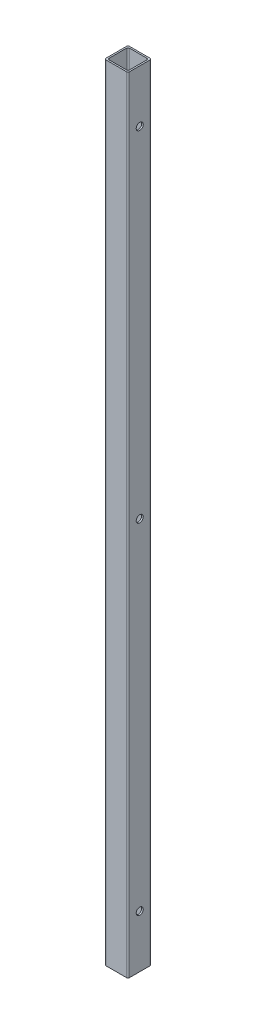
ISO-10303-21;
HEADER;
FILE_DESCRIPTION(('STEP AP214'),'2;1');
FILE_NAME('part.step','',(''),(''),'','','');
FILE_SCHEMA(('AUTOMOTIVE_DESIGN { 1 0 10303 214 1 1 1 1 }'));
ENDSEC;
DATA;
#1=APPLICATION_CONTEXT('core data for automotive mechanical design processes');
#2=APPLICATION_PROTOCOL_DEFINITION('international standard','automotive_design',2000,#1);
#3=PRODUCT_CONTEXT('',#1,'mechanical');
#4=PRODUCT('Part','Part','',(#3));
#5=PRODUCT_RELATED_PRODUCT_CATEGORY('part','',(#4));
#6=PRODUCT_DEFINITION_FORMATION('','',#4);
#7=PRODUCT_DEFINITION_CONTEXT('part definition',#1,'design');
#8=PRODUCT_DEFINITION('design','',#6,#7);
#9=PRODUCT_DEFINITION_SHAPE('','',#8);
#10=(LENGTH_UNIT() NAMED_UNIT(*) SI_UNIT(.MILLI.,.METRE.));
#11=(NAMED_UNIT(*) PLANE_ANGLE_UNIT() SI_UNIT($,.RADIAN.));
#12=(NAMED_UNIT(*) SI_UNIT($,.STERADIAN.) SOLID_ANGLE_UNIT());
#13=UNCERTAINTY_MEASURE_WITH_UNIT(LENGTH_MEASURE(1.E-05),#10,'distance_accuracy_value','');
#14=(GEOMETRIC_REPRESENTATION_CONTEXT(3) GLOBAL_UNCERTAINTY_ASSIGNED_CONTEXT((#13)) GLOBAL_UNIT_ASSIGNED_CONTEXT((#10,
#11,#12)) REPRESENTATION_CONTEXT('',''));
#15=CARTESIAN_POINT('',(0.,0.,0.));
#16=DIRECTION('',(0.,0.,1.));
#17=DIRECTION('',(1.,0.,0.));
#18=AXIS2_PLACEMENT_3D('',#15,#16,#17);
#19=CARTESIAN_POINT('',(9.652,645.16,9.652));
#20=DIRECTION('',(-1.,0.,0.));
#21=DIRECTION('',(0.,0.,1.));
#22=AXIS2_PLACEMENT_3D('',#19,#20,#21);
#23=PLANE('',#22);
#24=CARTESIAN_POINT('',(9.652,601.98,0.));
#25=DIRECTION('',(1.,0.,0.));
#26=DIRECTION('',(0.,0.,-1.));
#27=AXIS2_PLACEMENT_3D('',#24,#25,#26);
#28=CIRCLE('',#27,2.8956);
#29=CARTESIAN_POINT('',(9.652,601.98,-2.8956));
#30=VERTEX_POINT('',#29);
#31=EDGE_CURVE('E604',#30,#30,#28,.T.);
#32=ORIENTED_EDGE('',*,*,#31,.F.);
#33=EDGE_LOOP('',(#32));
#34=FACE_BOUND('',#33,.T.);
#35=CARTESIAN_POINT('',(9.652,322.58,0.));
#36=DIRECTION('',(1.,0.,0.));
#37=DIRECTION('',(0.,0.,-1.));
#38=AXIS2_PLACEMENT_3D('',#35,#36,#37);
#39=CIRCLE('',#38,2.8956);
#40=CARTESIAN_POINT('',(9.652,322.58,-2.8956));
#41=VERTEX_POINT('',#40);
#42=EDGE_CURVE('E257',#41,#41,#39,.T.);
#43=ORIENTED_EDGE('',*,*,#42,.F.);
#44=EDGE_LOOP('',(#43));
#45=FACE_BOUND('',#44,.T.);
#46=DIRECTION('',(0.,0.,-1.));
#47=VECTOR('',#46,1.);
#48=CARTESIAN_POINT('',(9.652,0.,9.652));
#49=LINE('',#48,#47);
#50=CARTESIAN_POINT('',(9.652,0.,8.382));
#51=VERTEX_POINT('',#50);
#52=CARTESIAN_POINT('',(9.652,0.,-8.382));
#53=VERTEX_POINT('',#52);
#54=EDGE_CURVE('E284',#51,#53,#49,.T.);
#55=ORIENTED_EDGE('',*,*,#54,.T.);
#56=DIRECTION('',(0.,-1.,0.));
#57=VECTOR('',#56,1.);
#58=CARTESIAN_POINT('',(9.652,645.16,-8.382));
#59=LINE('',#58,#57);
#60=CARTESIAN_POINT('',(9.652,645.16,-8.382));
#61=VERTEX_POINT('',#60);
#62=EDGE_CURVE('E232',#53,#61,#59,.F.);
#63=ORIENTED_EDGE('',*,*,#62,.T.);
#64=DIRECTION('',(0.,0.,-1.));
#65=VECTOR('',#64,1.);
#66=CARTESIAN_POINT('',(9.652,645.16,9.652));
#67=LINE('',#66,#65);
#68=CARTESIAN_POINT('',(9.652,645.16,8.382));
#69=VERTEX_POINT('',#68);
#70=EDGE_CURVE('E290',#69,#61,#67,.T.);
#71=ORIENTED_EDGE('',*,*,#70,.F.);
#72=DIRECTION('',(0.,-1.,0.));
#73=VECTOR('',#72,1.);
#74=CARTESIAN_POINT('',(9.652,645.16,8.382));
#75=LINE('',#74,#73);
#76=EDGE_CURVE('E229',#69,#51,#75,.T.);
#77=ORIENTED_EDGE('',*,*,#76,.T.);
#78=EDGE_LOOP('',(#55,#63,#71,#77));
#79=FACE_BOUND('',#78,.T.);
#80=CARTESIAN_POINT('',(9.652,43.18,0.));
#81=DIRECTION('',(1.,0.,0.));
#82=DIRECTION('',(0.,0.,-1.));
#83=AXIS2_PLACEMENT_3D('',#80,#81,#82);
#84=CIRCLE('',#83,2.89559999999998);
#85=CARTESIAN_POINT('',(9.652,43.18,-2.89559999999999));
#86=VERTEX_POINT('',#85);
#87=EDGE_CURVE('E254',#86,#86,#84,.T.);
#88=ORIENTED_EDGE('',*,*,#87,.F.);
#89=EDGE_LOOP('',(#88));
#90=FACE_BOUND('',#89,.T.);
#91=ADVANCED_FACE('F35',(#34,#45,#79,#90),#23,.F.);
#92=CARTESIAN_POINT('',(0.,645.16,0.));
#93=DIRECTION('',(0.,-1.,0.));
#94=DIRECTION('',(0.,0.,-1.));
#95=AXIS2_PLACEMENT_3D('',#92,#93,#94);
#96=PLANE('',#95);
#97=DIRECTION('',(0.,0.,1.));
#98=VECTOR('',#97,1.);
#99=CARTESIAN_POINT('',(-9.652,645.16,9.652));
#100=LINE('',#99,#98);
#101=CARTESIAN_POINT('',(-9.652,645.16,-8.382));
#102=VERTEX_POINT('',#101);
#103=CARTESIAN_POINT('',(-9.652,645.16,8.382));
#104=VERTEX_POINT('',#103);
#105=EDGE_CURVE('E181',#102,#104,#100,.T.);
#106=ORIENTED_EDGE('',*,*,#105,.T.);
#107=CARTESIAN_POINT('',(-8.382,645.16,8.382));
#108=DIRECTION('',(0.,-1.,0.));
#109=DIRECTION('',(0.,0.,-1.));
#110=AXIS2_PLACEMENT_3D('',#107,#108,#109);
#111=CIRCLE('',#110,1.27);
#112=CARTESIAN_POINT('',(-8.382,645.16,9.652));
#113=VERTEX_POINT('',#112);
#114=EDGE_CURVE('E223',#104,#113,#111,.F.);
#115=ORIENTED_EDGE('',*,*,#114,.T.);
#116=DIRECTION('',(1.,0.,0.));
#117=VECTOR('',#116,1.);
#118=CARTESIAN_POINT('',(-9.652,645.16,9.652));
#119=LINE('',#118,#117);
#120=CARTESIAN_POINT('',(8.382,645.16,9.652));
#121=VERTEX_POINT('',#120);
#122=EDGE_CURVE('E176',#113,#121,#119,.T.);
#123=ORIENTED_EDGE('',*,*,#122,.T.);
#124=CARTESIAN_POINT('',(8.382,645.16,8.382));
#125=DIRECTION('',(0.,-1.,0.));
#126=DIRECTION('',(0.,0.,-1.));
#127=AXIS2_PLACEMENT_3D('',#124,#125,#126);
#128=CIRCLE('',#127,1.27);
#129=EDGE_CURVE('E218',#121,#69,#128,.F.);
#130=ORIENTED_EDGE('',*,*,#129,.T.);
#131=ORIENTED_EDGE('',*,*,#70,.T.);
#132=CARTESIAN_POINT('',(8.382,645.16,-8.382));
#133=DIRECTION('',(0.,-1.,0.));
#134=DIRECTION('',(0.,0.,-1.));
#135=AXIS2_PLACEMENT_3D('',#132,#133,#134);
#136=CIRCLE('',#135,1.27);
#137=CARTESIAN_POINT('',(8.382,645.16,-9.652));
#138=VERTEX_POINT('',#137);
#139=EDGE_CURVE('E59',#61,#138,#136,.F.);
#140=ORIENTED_EDGE('',*,*,#139,.T.);
#141=DIRECTION('',(-1.,0.,0.));
#142=VECTOR('',#141,1.);
#143=CARTESIAN_POINT('',(-9.652,645.16,-9.652));
#144=LINE('',#143,#142);
#145=CARTESIAN_POINT('',(-8.382,645.16,-9.652));
#146=VERTEX_POINT('',#145);
#147=EDGE_CURVE('E292',#138,#146,#144,.T.);
#148=ORIENTED_EDGE('',*,*,#147,.T.);
#149=CARTESIAN_POINT('',(-8.382,645.16,-8.382));
#150=DIRECTION('',(0.,-1.,0.));
#151=DIRECTION('',(0.,0.,-1.));
#152=AXIS2_PLACEMENT_3D('',#149,#150,#151);
#153=CIRCLE('',#152,1.27);
#154=EDGE_CURVE('E221',#146,#102,#153,.F.);
#155=ORIENTED_EDGE('',*,*,#154,.T.);
#156=EDGE_LOOP('',(#106,#115,#123,#130,#131,#140,#148,#155));
#157=FACE_BOUND('',#156,.T.);
#158=DIRECTION('',(1.,0.,0.));
#159=VECTOR('',#158,1.);
#160=CARTESIAN_POINT('',(-8.382,645.16,8.382));
#161=LINE('',#160,#159);
#162=CARTESIAN_POINT('',(-7.112,645.16,8.382));
#163=VERTEX_POINT('',#162);
#164=CARTESIAN_POINT('',(7.112,645.16,8.382));
#165=VERTEX_POINT('',#164);
#166=EDGE_CURVE('E273',#163,#165,#161,.T.);
#167=ORIENTED_EDGE('',*,*,#166,.F.);
#168=CARTESIAN_POINT('',(-7.112,645.16,7.112));
#169=DIRECTION('',(0.,-1.,0.));
#170=DIRECTION('',(0.,0.,-1.));
#171=AXIS2_PLACEMENT_3D('',#168,#169,#170);
#172=CIRCLE('',#171,1.27);
#173=CARTESIAN_POINT('',(-8.382,645.16,7.112));
#174=VERTEX_POINT('',#173);
#175=EDGE_CURVE('E11',#163,#174,#172,.T.);
#176=ORIENTED_EDGE('',*,*,#175,.T.);
#177=DIRECTION('',(0.,0.,1.));
#178=VECTOR('',#177,1.);
#179=CARTESIAN_POINT('',(-8.382,645.16,8.382));
#180=LINE('',#179,#178);
#181=CARTESIAN_POINT('',(-8.382,645.16,-7.11199999999999));
#182=VERTEX_POINT('',#181);
#183=EDGE_CURVE('E281',#182,#174,#180,.T.);
#184=ORIENTED_EDGE('',*,*,#183,.F.);
#185=CARTESIAN_POINT('',(-7.112,645.16,-7.112));
#186=DIRECTION('',(0.,-1.,0.));
#187=DIRECTION('',(0.,0.,-1.));
#188=AXIS2_PLACEMENT_3D('',#185,#186,#187);
#189=CIRCLE('',#188,1.27);
#190=CARTESIAN_POINT('',(-7.112,645.16,-8.382));
#191=VERTEX_POINT('',#190);
#192=EDGE_CURVE('E236',#182,#191,#189,.T.);
#193=ORIENTED_EDGE('',*,*,#192,.T.);
#194=DIRECTION('',(-1.,0.,0.));
#195=VECTOR('',#194,1.);
#196=CARTESIAN_POINT('',(-8.382,645.16,-8.382));
#197=LINE('',#196,#195);
#198=CARTESIAN_POINT('',(7.112,645.16,-8.382));
#199=VERTEX_POINT('',#198);
#200=EDGE_CURVE('E279',#199,#191,#197,.T.);
#201=ORIENTED_EDGE('',*,*,#200,.F.);
#202=CARTESIAN_POINT('',(7.112,645.16,-7.112));
#203=DIRECTION('',(0.,-1.,0.));
#204=DIRECTION('',(0.,0.,-1.));
#205=AXIS2_PLACEMENT_3D('',#202,#203,#204);
#206=CIRCLE('',#205,1.27);
#207=CARTESIAN_POINT('',(8.382,645.16,-7.11199999999999));
#208=VERTEX_POINT('',#207);
#209=EDGE_CURVE('E161',#199,#208,#206,.T.);
#210=ORIENTED_EDGE('',*,*,#209,.T.);
#211=DIRECTION('',(0.,0.,-1.));
#212=VECTOR('',#211,1.);
#213=CARTESIAN_POINT('',(8.382,645.16,8.382));
#214=LINE('',#213,#212);
#215=CARTESIAN_POINT('',(8.382,645.16,7.112));
#216=VERTEX_POINT('',#215);
#217=EDGE_CURVE('E276',#216,#208,#214,.T.);
#218=ORIENTED_EDGE('',*,*,#217,.F.);
#219=CARTESIAN_POINT('',(7.112,645.16,7.112));
#220=DIRECTION('',(0.,-1.,0.));
#221=DIRECTION('',(0.,0.,-1.));
#222=AXIS2_PLACEMENT_3D('',#219,#220,#221);
#223=CIRCLE('',#222,1.27);
#224=EDGE_CURVE('E162',#216,#165,#223,.T.);
#225=ORIENTED_EDGE('',*,*,#224,.T.);
#226=EDGE_LOOP('',(#167,#176,#184,#193,#201,#210,#218,#225));
#227=FACE_BOUND('',#226,.T.);
#228=ADVANCED_FACE('F316',(#157,#227),#96,.F.);
#229=CARTESIAN_POINT('',(0.,0.,0.));
#230=DIRECTION('',(0.,-1.,0.));
#231=DIRECTION('',(0.,0.,-1.));
#232=AXIS2_PLACEMENT_3D('',#229,#230,#231);
#233=PLANE('',#232);
#234=DIRECTION('',(1.,0.,0.));
#235=VECTOR('',#234,1.);
#236=CARTESIAN_POINT('',(-9.652,0.,9.652));
#237=LINE('',#236,#235);
#238=CARTESIAN_POINT('',(-8.382,0.,9.652));
#239=VERTEX_POINT('',#238);
#240=CARTESIAN_POINT('',(8.382,0.,9.652));
#241=VERTEX_POINT('',#240);
#242=EDGE_CURVE('E184',#239,#241,#237,.T.);
#243=ORIENTED_EDGE('',*,*,#242,.F.);
#244=CARTESIAN_POINT('',(-8.382,0.,8.382));
#245=DIRECTION('',(0.,-1.,0.));
#246=DIRECTION('',(0.,0.,-1.));
#247=AXIS2_PLACEMENT_3D('',#244,#245,#246);
#248=CIRCLE('',#247,1.27);
#249=CARTESIAN_POINT('',(-9.652,0.,8.382));
#250=VERTEX_POINT('',#249);
#251=EDGE_CURVE('E211',#239,#250,#248,.T.);
#252=ORIENTED_EDGE('',*,*,#251,.T.);
#253=DIRECTION('',(0.,0.,1.));
#254=VECTOR('',#253,1.);
#255=CARTESIAN_POINT('',(-9.652,0.,9.652));
#256=LINE('',#255,#254);
#257=CARTESIAN_POINT('',(-9.652,0.,-8.382));
#258=VERTEX_POINT('',#257);
#259=EDGE_CURVE('E299',#258,#250,#256,.T.);
#260=ORIENTED_EDGE('',*,*,#259,.F.);
#261=CARTESIAN_POINT('',(-8.382,0.,-8.382));
#262=DIRECTION('',(0.,-1.,0.));
#263=DIRECTION('',(0.,0.,-1.));
#264=AXIS2_PLACEMENT_3D('',#261,#262,#263);
#265=CIRCLE('',#264,1.27);
#266=CARTESIAN_POINT('',(-8.382,0.,-9.652));
#267=VERTEX_POINT('',#266);
#268=EDGE_CURVE('E209',#258,#267,#265,.T.);
#269=ORIENTED_EDGE('',*,*,#268,.T.);
#270=DIRECTION('',(-1.,0.,0.));
#271=VECTOR('',#270,1.);
#272=CARTESIAN_POINT('',(-9.652,0.,-9.652));
#273=LINE('',#272,#271);
#274=CARTESIAN_POINT('',(8.382,0.,-9.652));
#275=VERTEX_POINT('',#274);
#276=EDGE_CURVE('E298',#275,#267,#273,.T.);
#277=ORIENTED_EDGE('',*,*,#276,.F.);
#278=CARTESIAN_POINT('',(8.382,0.,-8.382));
#279=DIRECTION('',(0.,-1.,0.));
#280=DIRECTION('',(0.,0.,-1.));
#281=AXIS2_PLACEMENT_3D('',#278,#279,#280);
#282=CIRCLE('',#281,1.27);
#283=EDGE_CURVE('E207',#275,#53,#282,.T.);
#284=ORIENTED_EDGE('',*,*,#283,.T.);
#285=ORIENTED_EDGE('',*,*,#54,.F.);
#286=CARTESIAN_POINT('',(8.382,0.,8.382));
#287=DIRECTION('',(0.,-1.,0.));
#288=DIRECTION('',(0.,0.,-1.));
#289=AXIS2_PLACEMENT_3D('',#286,#287,#288);
#290=CIRCLE('',#289,1.27);
#291=EDGE_CURVE('E205',#51,#241,#290,.T.);
#292=ORIENTED_EDGE('',*,*,#291,.T.);
#293=EDGE_LOOP('',(#243,#252,#260,#269,#277,#284,#285,#292));
#294=FACE_BOUND('',#293,.T.);
#295=DIRECTION('',(-1.,0.,0.));
#296=VECTOR('',#295,1.);
#297=CARTESIAN_POINT('',(-8.382,0.,-8.382));
#298=LINE('',#297,#296);
#299=CARTESIAN_POINT('',(7.112,0.,-8.382));
#300=VERTEX_POINT('',#299);
#301=CARTESIAN_POINT('',(-7.112,0.,-8.382));
#302=VERTEX_POINT('',#301);
#303=EDGE_CURVE('E154',#300,#302,#298,.T.);
#304=ORIENTED_EDGE('',*,*,#303,.T.);
#305=CARTESIAN_POINT('',(-7.112,0.,-7.112));
#306=DIRECTION('',(0.,-1.,0.));
#307=DIRECTION('',(0.,0.,-1.));
#308=AXIS2_PLACEMENT_3D('',#305,#306,#307);
#309=CIRCLE('',#308,1.27);
#310=CARTESIAN_POINT('',(-8.382,0.,-7.11199999999999));
#311=VERTEX_POINT('',#310);
#312=EDGE_CURVE('E234',#302,#311,#309,.F.);
#313=ORIENTED_EDGE('',*,*,#312,.T.);
#314=DIRECTION('',(0.,0.,1.));
#315=VECTOR('',#314,1.);
#316=CARTESIAN_POINT('',(-8.382,0.,8.382));
#317=LINE('',#316,#315);
#318=CARTESIAN_POINT('',(-8.382,0.,7.112));
#319=VERTEX_POINT('',#318);
#320=EDGE_CURVE('E172',#311,#319,#317,.T.);
#321=ORIENTED_EDGE('',*,*,#320,.T.);
#322=CARTESIAN_POINT('',(-7.112,0.,7.112));
#323=DIRECTION('',(0.,-1.,0.));
#324=DIRECTION('',(0.,0.,-1.));
#325=AXIS2_PLACEMENT_3D('',#322,#323,#324);
#326=CIRCLE('',#325,1.27);
#327=CARTESIAN_POINT('',(-7.112,0.,8.382));
#328=VERTEX_POINT('',#327);
#329=EDGE_CURVE('E44',#319,#328,#326,.F.);
#330=ORIENTED_EDGE('',*,*,#329,.T.);
#331=DIRECTION('',(1.,0.,0.));
#332=VECTOR('',#331,1.);
#333=CARTESIAN_POINT('',(-8.382,0.,8.382));
#334=LINE('',#333,#332);
#335=CARTESIAN_POINT('',(7.112,0.,8.382));
#336=VERTEX_POINT('',#335);
#337=EDGE_CURVE('E272',#328,#336,#334,.T.);
#338=ORIENTED_EDGE('',*,*,#337,.T.);
#339=CARTESIAN_POINT('',(7.112,0.,7.112));
#340=DIRECTION('',(0.,-1.,0.));
#341=DIRECTION('',(0.,0.,-1.));
#342=AXIS2_PLACEMENT_3D('',#339,#340,#341);
#343=CIRCLE('',#342,1.27);
#344=CARTESIAN_POINT('',(8.382,0.,7.112));
#345=VERTEX_POINT('',#344);
#346=EDGE_CURVE('E238',#336,#345,#343,.F.);
#347=ORIENTED_EDGE('',*,*,#346,.T.);
#348=DIRECTION('',(0.,0.,-1.));
#349=VECTOR('',#348,1.);
#350=CARTESIAN_POINT('',(8.382,0.,8.382));
#351=LINE('',#350,#349);
#352=CARTESIAN_POINT('',(8.382,0.,-7.11199999999999));
#353=VERTEX_POINT('',#352);
#354=EDGE_CURVE('E156',#345,#353,#351,.T.);
#355=ORIENTED_EDGE('',*,*,#354,.T.);
#356=CARTESIAN_POINT('',(7.112,0.,-7.112));
#357=DIRECTION('',(0.,-1.,0.));
#358=DIRECTION('',(0.,0.,-1.));
#359=AXIS2_PLACEMENT_3D('',#356,#357,#358);
#360=CIRCLE('',#359,1.27);
#361=EDGE_CURVE('E151',#353,#300,#360,.F.);
#362=ORIENTED_EDGE('',*,*,#361,.T.);
#363=EDGE_LOOP('',(#304,#313,#321,#330,#338,#347,#355,#362));
#364=FACE_BOUND('',#363,.T.);
#365=ADVANCED_FACE('F153',(#294,#364),#233,.T.);
#366=CARTESIAN_POINT('',(-9.652,645.16,-9.652));
#367=DIRECTION('',(0.,0.,1.));
#368=DIRECTION('',(1.,0.,0.));
#369=AXIS2_PLACEMENT_3D('',#366,#367,#368);
#370=PLANE('',#369);
#371=ORIENTED_EDGE('',*,*,#276,.T.);
#372=DIRECTION('',(0.,-1.,0.));
#373=VECTOR('',#372,1.);
#374=CARTESIAN_POINT('',(-8.382,645.16,-9.652));
#375=LINE('',#374,#373);
#376=EDGE_CURVE('E52',#267,#146,#375,.F.);
#377=ORIENTED_EDGE('',*,*,#376,.T.);
#378=ORIENTED_EDGE('',*,*,#147,.F.);
#379=DIRECTION('',(0.,-1.,0.));
#380=VECTOR('',#379,1.);
#381=CARTESIAN_POINT('',(8.382,645.16,-9.652));
#382=LINE('',#381,#380);
#383=EDGE_CURVE('E225',#138,#275,#382,.T.);
#384=ORIENTED_EDGE('',*,*,#383,.T.);
#385=EDGE_LOOP('',(#371,#377,#378,#384));
#386=FACE_BOUND('',#385,.T.);
#387=ADVANCED_FACE('F326',(#386),#370,.F.);
#388=CARTESIAN_POINT('',(-9.652,645.16,9.652));
#389=DIRECTION('',(1.,0.,0.));
#390=DIRECTION('',(0.,0.,-1.));
#391=AXIS2_PLACEMENT_3D('',#388,#389,#390);
#392=PLANE('',#391);
#393=CARTESIAN_POINT('',(-9.652,601.98,0.));
#394=DIRECTION('',(1.,0.,0.));
#395=DIRECTION('',(0.,0.,-1.));
#396=AXIS2_PLACEMENT_3D('',#393,#394,#395);
#397=CIRCLE('',#396,2.8956);
#398=CARTESIAN_POINT('',(-9.652,601.98,-2.8956));
#399=VERTEX_POINT('',#398);
#400=EDGE_CURVE('E605',#399,#399,#397,.T.);
#401=ORIENTED_EDGE('',*,*,#400,.T.);
#402=EDGE_LOOP('',(#401));
#403=FACE_BOUND('',#402,.T.);
#404=CARTESIAN_POINT('',(-9.652,322.58,0.));
#405=DIRECTION('',(1.,0.,0.));
#406=DIRECTION('',(0.,0.,-1.));
#407=AXIS2_PLACEMENT_3D('',#404,#405,#406);
#408=CIRCLE('',#407,2.8956);
#409=CARTESIAN_POINT('',(-9.652,322.58,-2.8956));
#410=VERTEX_POINT('',#409);
#411=EDGE_CURVE('E250',#410,#410,#408,.T.);
#412=ORIENTED_EDGE('',*,*,#411,.T.);
#413=EDGE_LOOP('',(#412));
#414=FACE_BOUND('',#413,.T.);
#415=CARTESIAN_POINT('',(-9.652,43.18,0.));
#416=DIRECTION('',(1.,0.,0.));
#417=DIRECTION('',(0.,0.,-1.));
#418=AXIS2_PLACEMENT_3D('',#415,#416,#417);
#419=CIRCLE('',#418,2.89559999999998);
#420=CARTESIAN_POINT('',(-9.652,43.18,-2.89559999999999));
#421=VERTEX_POINT('',#420);
#422=EDGE_CURVE('E246',#421,#421,#419,.T.);
#423=ORIENTED_EDGE('',*,*,#422,.T.);
#424=EDGE_LOOP('',(#423));
#425=FACE_BOUND('',#424,.T.);
#426=ORIENTED_EDGE('',*,*,#259,.T.);
#427=DIRECTION('',(0.,-1.,0.));
#428=VECTOR('',#427,1.);
#429=CARTESIAN_POINT('',(-9.652,645.16,8.382));
#430=LINE('',#429,#428);
#431=EDGE_CURVE('E216',#250,#104,#430,.F.);
#432=ORIENTED_EDGE('',*,*,#431,.T.);
#433=ORIENTED_EDGE('',*,*,#105,.F.);
#434=DIRECTION('',(0.,-1.,0.));
#435=VECTOR('',#434,1.);
#436=CARTESIAN_POINT('',(-9.652,645.16,-8.382));
#437=LINE('',#436,#435);
#438=EDGE_CURVE('E213',#102,#258,#437,.T.);
#439=ORIENTED_EDGE('',*,*,#438,.T.);
#440=EDGE_LOOP('',(#426,#432,#433,#439));
#441=FACE_BOUND('',#440,.T.);
#442=ADVANCED_FACE('F332',(#403,#414,#425,#441),#392,.F.);
#443=CARTESIAN_POINT('',(-9.652,645.16,9.652));
#444=DIRECTION('',(0.,0.,-1.));
#445=DIRECTION('',(-1.,0.,0.));
#446=AXIS2_PLACEMENT_3D('',#443,#444,#445);
#447=PLANE('',#446);
#448=ORIENTED_EDGE('',*,*,#122,.F.);
#449=DIRECTION('',(0.,-1.,0.));
#450=VECTOR('',#449,1.);
#451=CARTESIAN_POINT('',(-8.382,645.16,9.652));
#452=LINE('',#451,#450);
#453=EDGE_CURVE('E202',#113,#239,#452,.T.);
#454=ORIENTED_EDGE('',*,*,#453,.T.);
#455=ORIENTED_EDGE('',*,*,#242,.T.);
#456=DIRECTION('',(0.,-1.,0.));
#457=VECTOR('',#456,1.);
#458=CARTESIAN_POINT('',(8.382,645.16,9.652));
#459=LINE('',#458,#457);
#460=EDGE_CURVE('E200',#241,#121,#459,.F.);
#461=ORIENTED_EDGE('',*,*,#460,.T.);
#462=EDGE_LOOP('',(#448,#454,#455,#461));
#463=FACE_BOUND('',#462,.T.);
#464=ADVANCED_FACE('F309',(#463),#447,.F.);
#465=CARTESIAN_POINT('',(-8.382,645.16,8.382));
#466=DIRECTION('',(0.,0.,-1.));
#467=DIRECTION('',(-1.,0.,0.));
#468=AXIS2_PLACEMENT_3D('',#465,#466,#467);
#469=PLANE('',#468);
#470=ORIENTED_EDGE('',*,*,#166,.T.);
#471=DIRECTION('',(0.,-1.,0.));
#472=VECTOR('',#471,1.);
#473=CARTESIAN_POINT('',(7.112,0.,8.382));
#474=LINE('',#473,#472);
#475=EDGE_CURVE('E193',#165,#336,#474,.T.);
#476=ORIENTED_EDGE('',*,*,#475,.T.);
#477=ORIENTED_EDGE('',*,*,#337,.F.);
#478=DIRECTION('',(0.,-1.,0.));
#479=VECTOR('',#478,1.);
#480=CARTESIAN_POINT('',(-7.112,645.16,8.382));
#481=LINE('',#480,#479);
#482=EDGE_CURVE('E191',#328,#163,#481,.F.);
#483=ORIENTED_EDGE('',*,*,#482,.T.);
#484=EDGE_LOOP('',(#470,#476,#477,#483));
#485=FACE_BOUND('',#484,.T.);
#486=ADVANCED_FACE('F436',(#485),#469,.T.);
#487=CARTESIAN_POINT('',(8.382,645.16,8.382));
#488=DIRECTION('',(-1.,0.,0.));
#489=DIRECTION('',(0.,0.,1.));
#490=AXIS2_PLACEMENT_3D('',#487,#488,#489);
#491=PLANE('',#490);
#492=CARTESIAN_POINT('',(8.382,601.98,0.));
#493=DIRECTION('',(-1.,0.,0.));
#494=DIRECTION('',(0.,0.,1.));
#495=AXIS2_PLACEMENT_3D('',#492,#493,#494);
#496=CIRCLE('',#495,2.8956);
#497=CARTESIAN_POINT('',(8.382,601.98,2.89559999999999));
#498=VERTEX_POINT('',#497);
#499=EDGE_CURVE('E262',#498,#498,#496,.T.);
#500=ORIENTED_EDGE('',*,*,#499,.F.);
#501=EDGE_LOOP('',(#500));
#502=FACE_BOUND('',#501,.T.);
#503=CARTESIAN_POINT('',(8.382,322.58,0.));
#504=DIRECTION('',(-1.,0.,0.));
#505=DIRECTION('',(0.,0.,1.));
#506=AXIS2_PLACEMENT_3D('',#503,#504,#505);
#507=CIRCLE('',#506,2.8956);
#508=CARTESIAN_POINT('',(8.382,322.58,2.89559999999999));
#509=VERTEX_POINT('',#508);
#510=EDGE_CURVE('E249',#509,#509,#507,.T.);
#511=ORIENTED_EDGE('',*,*,#510,.F.);
#512=EDGE_LOOP('',(#511));
#513=FACE_BOUND('',#512,.T.);
#514=CARTESIAN_POINT('',(8.382,43.18,0.));
#515=DIRECTION('',(-1.,0.,0.));
#516=DIRECTION('',(0.,0.,1.));
#517=AXIS2_PLACEMENT_3D('',#514,#515,#516);
#518=CIRCLE('',#517,2.89559999999998);
#519=CARTESIAN_POINT('',(8.382,43.18,2.89559999999998));
#520=VERTEX_POINT('',#519);
#521=EDGE_CURVE('E245',#520,#520,#518,.T.);
#522=ORIENTED_EDGE('',*,*,#521,.F.);
#523=EDGE_LOOP('',(#522));
#524=FACE_BOUND('',#523,.T.);
#525=ORIENTED_EDGE('',*,*,#354,.F.);
#526=DIRECTION('',(0.,-1.,0.));
#527=VECTOR('',#526,1.);
#528=CARTESIAN_POINT('',(8.382,645.16,7.112));
#529=LINE('',#528,#527);
#530=EDGE_CURVE('E198',#345,#216,#529,.F.);
#531=ORIENTED_EDGE('',*,*,#530,.T.);
#532=ORIENTED_EDGE('',*,*,#217,.T.);
#533=DIRECTION('',(0.,-1.,0.));
#534=VECTOR('',#533,1.);
#535=CARTESIAN_POINT('',(8.382,0.,-7.112));
#536=LINE('',#535,#534);
#537=EDGE_CURVE('E196',#208,#353,#536,.T.);
#538=ORIENTED_EDGE('',*,*,#537,.T.);
#539=EDGE_LOOP('',(#525,#531,#532,#538));
#540=FACE_BOUND('',#539,.T.);
#541=ADVANCED_FACE('F433',(#502,#513,#524,#540),#491,.T.);
#542=CARTESIAN_POINT('',(-8.382,645.16,-8.382));
#543=DIRECTION('',(0.,0.,1.));
#544=DIRECTION('',(1.,0.,0.));
#545=AXIS2_PLACEMENT_3D('',#542,#543,#544);
#546=PLANE('',#545);
#547=ORIENTED_EDGE('',*,*,#200,.T.);
#548=DIRECTION('',(0.,-1.,0.));
#549=VECTOR('',#548,1.);
#550=CARTESIAN_POINT('',(-7.112,0.,-8.382));
#551=LINE('',#550,#549);
#552=EDGE_CURVE('E171',#191,#302,#551,.T.);
#553=ORIENTED_EDGE('',*,*,#552,.T.);
#554=ORIENTED_EDGE('',*,*,#303,.F.);
#555=DIRECTION('',(0.,-1.,0.));
#556=VECTOR('',#555,1.);
#557=CARTESIAN_POINT('',(7.112,645.16,-8.382));
#558=LINE('',#557,#556);
#559=EDGE_CURVE('E168',#300,#199,#558,.F.);
#560=ORIENTED_EDGE('',*,*,#559,.T.);
#561=EDGE_LOOP('',(#547,#553,#554,#560));
#562=FACE_BOUND('',#561,.T.);
#563=ADVANCED_FACE('F167',(#562),#546,.T.);
#564=CARTESIAN_POINT('',(-8.382,645.16,8.382));
#565=DIRECTION('',(1.,0.,0.));
#566=DIRECTION('',(0.,0.,-1.));
#567=AXIS2_PLACEMENT_3D('',#564,#565,#566);
#568=PLANE('',#567);
#569=CARTESIAN_POINT('',(-8.382,601.98,0.));
#570=DIRECTION('',(1.,0.,0.));
#571=DIRECTION('',(0.,0.,-1.));
#572=AXIS2_PLACEMENT_3D('',#569,#570,#571);
#573=CIRCLE('',#572,2.8956);
#574=CARTESIAN_POINT('',(-8.382,601.98,-2.8956));
#575=VERTEX_POINT('',#574);
#576=EDGE_CURVE('E39',#575,#575,#573,.T.);
#577=ORIENTED_EDGE('',*,*,#576,.F.);
#578=EDGE_LOOP('',(#577));
#579=FACE_BOUND('',#578,.T.);
#580=CARTESIAN_POINT('',(-8.382,322.58,0.));
#581=DIRECTION('',(1.,0.,0.));
#582=DIRECTION('',(0.,0.,-1.));
#583=AXIS2_PLACEMENT_3D('',#580,#581,#582);
#584=CIRCLE('',#583,2.8956);
#585=CARTESIAN_POINT('',(-8.382,322.58,-2.8956));
#586=VERTEX_POINT('',#585);
#587=EDGE_CURVE('E247',#586,#586,#584,.T.);
#588=ORIENTED_EDGE('',*,*,#587,.F.);
#589=EDGE_LOOP('',(#588));
#590=FACE_BOUND('',#589,.T.);
#591=CARTESIAN_POINT('',(-8.382,43.18,0.));
#592=DIRECTION('',(1.,0.,0.));
#593=DIRECTION('',(0.,0.,-1.));
#594=AXIS2_PLACEMENT_3D('',#591,#592,#593);
#595=CIRCLE('',#594,2.89559999999998);
#596=CARTESIAN_POINT('',(-8.382,43.18,-2.89559999999999));
#597=VERTEX_POINT('',#596);
#598=EDGE_CURVE('E243',#597,#597,#595,.T.);
#599=ORIENTED_EDGE('',*,*,#598,.F.);
#600=EDGE_LOOP('',(#599));
#601=FACE_BOUND('',#600,.T.);
#602=ORIENTED_EDGE('',*,*,#320,.F.);
#603=DIRECTION('',(0.,-1.,0.));
#604=VECTOR('',#603,1.);
#605=CARTESIAN_POINT('',(-8.382,645.16,-7.112));
#606=LINE('',#605,#604);
#607=EDGE_CURVE('E189',#311,#182,#606,.F.);
#608=ORIENTED_EDGE('',*,*,#607,.T.);
#609=ORIENTED_EDGE('',*,*,#183,.T.);
#610=DIRECTION('',(0.,-1.,0.));
#611=VECTOR('',#610,1.);
#612=CARTESIAN_POINT('',(-8.382,0.,7.112));
#613=LINE('',#612,#611);
#614=EDGE_CURVE('E178',#174,#319,#613,.T.);
#615=ORIENTED_EDGE('',*,*,#614,.T.);
#616=EDGE_LOOP('',(#602,#608,#609,#615));
#617=FACE_BOUND('',#616,.T.);
#618=ADVANCED_FACE('F362',(#579,#590,#601,#617),#568,.T.);
#619=CARTESIAN_POINT('',(-7.112,645.16,-7.112));
#620=DIRECTION('',(0.,1.,0.));
#621=DIRECTION('',(0.,0.,1.));
#622=AXIS2_PLACEMENT_3D('',#619,#620,#621);
#623=CYLINDRICAL_SURFACE('',#622,1.27);
#624=ORIENTED_EDGE('',*,*,#192,.F.);
#625=ORIENTED_EDGE('',*,*,#607,.F.);
#626=ORIENTED_EDGE('',*,*,#312,.F.);
#627=ORIENTED_EDGE('',*,*,#552,.F.);
#628=EDGE_LOOP('',(#624,#625,#626,#627));
#629=FACE_BOUND('',#628,.T.);
#630=ADVANCED_FACE('F358',(#629),#623,.F.);
#631=CARTESIAN_POINT('',(7.112,645.16,7.112));
#632=DIRECTION('',(0.,1.,0.));
#633=DIRECTION('',(0.,0.,1.));
#634=AXIS2_PLACEMENT_3D('',#631,#632,#633);
#635=CYLINDRICAL_SURFACE('',#634,1.27);
#636=ORIENTED_EDGE('',*,*,#224,.F.);
#637=ORIENTED_EDGE('',*,*,#530,.F.);
#638=ORIENTED_EDGE('',*,*,#346,.F.);
#639=ORIENTED_EDGE('',*,*,#475,.F.);
#640=EDGE_LOOP('',(#636,#637,#638,#639));
#641=FACE_BOUND('',#640,.T.);
#642=ADVANCED_FACE('F361',(#641),#635,.F.);
#643=CARTESIAN_POINT('',(7.112,645.16,-7.112));
#644=DIRECTION('',(0.,1.,0.));
#645=DIRECTION('',(0.,0.,1.));
#646=AXIS2_PLACEMENT_3D('',#643,#644,#645);
#647=CYLINDRICAL_SURFACE('',#646,1.27);
#648=ORIENTED_EDGE('',*,*,#209,.F.);
#649=ORIENTED_EDGE('',*,*,#559,.F.);
#650=ORIENTED_EDGE('',*,*,#361,.F.);
#651=ORIENTED_EDGE('',*,*,#537,.F.);
#652=EDGE_LOOP('',(#648,#649,#650,#651));
#653=FACE_BOUND('',#652,.T.);
#654=ADVANCED_FACE('F175',(#653),#647,.F.);
#655=CARTESIAN_POINT('',(-7.112,645.16,7.112));
#656=DIRECTION('',(0.,1.,0.));
#657=DIRECTION('',(0.,0.,1.));
#658=AXIS2_PLACEMENT_3D('',#655,#656,#657);
#659=CYLINDRICAL_SURFACE('',#658,1.27);
#660=ORIENTED_EDGE('',*,*,#175,.F.);
#661=ORIENTED_EDGE('',*,*,#482,.F.);
#662=ORIENTED_EDGE('',*,*,#329,.F.);
#663=ORIENTED_EDGE('',*,*,#614,.F.);
#664=EDGE_LOOP('',(#660,#661,#662,#663));
#665=FACE_BOUND('',#664,.T.);
#666=ADVANCED_FACE('F337',(#665),#659,.F.);
#667=CARTESIAN_POINT('',(-8.382,645.16,8.382));
#668=DIRECTION('',(0.,-1.,0.));
#669=DIRECTION('',(0.,0.,-1.));
#670=AXIS2_PLACEMENT_3D('',#667,#668,#669);
#671=CYLINDRICAL_SURFACE('',#670,1.27);
#672=ORIENTED_EDGE('',*,*,#114,.F.);
#673=ORIENTED_EDGE('',*,*,#431,.F.);
#674=ORIENTED_EDGE('',*,*,#251,.F.);
#675=ORIENTED_EDGE('',*,*,#453,.F.);
#676=EDGE_LOOP('',(#672,#673,#674,#675));
#677=FACE_BOUND('',#676,.T.);
#678=ADVANCED_FACE('F335',(#677),#671,.T.);
#679=CARTESIAN_POINT('',(-8.382,645.16,-8.382));
#680=DIRECTION('',(0.,-1.,0.));
#681=DIRECTION('',(0.,0.,-1.));
#682=AXIS2_PLACEMENT_3D('',#679,#680,#681);
#683=CYLINDRICAL_SURFACE('',#682,1.27);
#684=ORIENTED_EDGE('',*,*,#154,.F.);
#685=ORIENTED_EDGE('',*,*,#376,.F.);
#686=ORIENTED_EDGE('',*,*,#268,.F.);
#687=ORIENTED_EDGE('',*,*,#438,.F.);
#688=EDGE_LOOP('',(#684,#685,#686,#687));
#689=FACE_BOUND('',#688,.T.);
#690=ADVANCED_FACE('F330',(#689),#683,.T.);
#691=CARTESIAN_POINT('',(8.382,645.16,-8.382));
#692=DIRECTION('',(0.,-1.,0.));
#693=DIRECTION('',(0.,0.,-1.));
#694=AXIS2_PLACEMENT_3D('',#691,#692,#693);
#695=CYLINDRICAL_SURFACE('',#694,1.27);
#696=ORIENTED_EDGE('',*,*,#139,.F.);
#697=ORIENTED_EDGE('',*,*,#62,.F.);
#698=ORIENTED_EDGE('',*,*,#283,.F.);
#699=ORIENTED_EDGE('',*,*,#383,.F.);
#700=EDGE_LOOP('',(#696,#697,#698,#699));
#701=FACE_BOUND('',#700,.T.);
#702=ADVANCED_FACE('F323',(#701),#695,.T.);
#703=CARTESIAN_POINT('',(8.382,645.16,8.382));
#704=DIRECTION('',(0.,-1.,0.));
#705=DIRECTION('',(0.,0.,-1.));
#706=AXIS2_PLACEMENT_3D('',#703,#704,#705);
#707=CYLINDRICAL_SURFACE('',#706,1.27);
#708=ORIENTED_EDGE('',*,*,#129,.F.);
#709=ORIENTED_EDGE('',*,*,#460,.F.);
#710=ORIENTED_EDGE('',*,*,#291,.F.);
#711=ORIENTED_EDGE('',*,*,#76,.F.);
#712=EDGE_LOOP('',(#708,#709,#710,#711));
#713=FACE_BOUND('',#712,.T.);
#714=ADVANCED_FACE('F37',(#713),#707,.T.);
#715=CARTESIAN_POINT('',(9.652,43.18,0.));
#716=DIRECTION('',(1.,0.,0.));
#717=DIRECTION('',(0.,0.,-1.));
#718=AXIS2_PLACEMENT_3D('',#715,#716,#717);
#719=CYLINDRICAL_SURFACE('',#718,2.89559999999998);
#720=ORIENTED_EDGE('',*,*,#598,.T.);
#721=EDGE_LOOP('',(#720));
#722=FACE_BOUND('',#721,.T.);
#723=ORIENTED_EDGE('',*,*,#422,.F.);
#724=EDGE_LOOP('',(#723));
#725=FACE_BOUND('',#724,.T.);
#726=ADVANCED_FACE('F401',(#722,#725),#719,.F.);
#727=ORIENTED_EDGE('',*,*,#521,.T.);
#728=EDGE_LOOP('',(#727));
#729=FACE_BOUND('',#728,.T.);
#730=ORIENTED_EDGE('',*,*,#87,.T.);
#731=EDGE_LOOP('',(#730));
#732=FACE_BOUND('',#731,.T.);
#733=ADVANCED_FACE('F488',(#729,#732),#719,.F.);
#734=CARTESIAN_POINT('',(9.652,322.58,0.));
#735=DIRECTION('',(1.,0.,0.));
#736=DIRECTION('',(0.,0.,-1.));
#737=AXIS2_PLACEMENT_3D('',#734,#735,#736);
#738=CYLINDRICAL_SURFACE('',#737,2.8956);
#739=ORIENTED_EDGE('',*,*,#587,.T.);
#740=EDGE_LOOP('',(#739));
#741=FACE_BOUND('',#740,.T.);
#742=ORIENTED_EDGE('',*,*,#411,.F.);
#743=EDGE_LOOP('',(#742));
#744=FACE_BOUND('',#743,.T.);
#745=ADVANCED_FACE('F497',(#741,#744),#738,.F.);
#746=ORIENTED_EDGE('',*,*,#510,.T.);
#747=EDGE_LOOP('',(#746));
#748=FACE_BOUND('',#747,.T.);
#749=ORIENTED_EDGE('',*,*,#42,.T.);
#750=EDGE_LOOP('',(#749));
#751=FACE_BOUND('',#750,.T.);
#752=ADVANCED_FACE('F505',(#748,#751),#738,.F.);
#753=CARTESIAN_POINT('',(9.652,601.98,0.));
#754=DIRECTION('',(1.,0.,0.));
#755=DIRECTION('',(0.,0.,-1.));
#756=AXIS2_PLACEMENT_3D('',#753,#754,#755);
#757=CYLINDRICAL_SURFACE('',#756,2.8956);
#758=ORIENTED_EDGE('',*,*,#576,.T.);
#759=EDGE_LOOP('',(#758));
#760=FACE_BOUND('',#759,.T.);
#761=ORIENTED_EDGE('',*,*,#400,.F.);
#762=EDGE_LOOP('',(#761));
#763=FACE_BOUND('',#762,.T.);
#764=ADVANCED_FACE('F513',(#760,#763),#757,.F.);
#765=ORIENTED_EDGE('',*,*,#499,.T.);
#766=EDGE_LOOP('',(#765));
#767=FACE_BOUND('',#766,.T.);
#768=ORIENTED_EDGE('',*,*,#31,.T.);
#769=EDGE_LOOP('',(#768));
#770=FACE_BOUND('',#769,.T.);
#771=ADVANCED_FACE('F521',(#767,#770),#757,.F.);
#772=CLOSED_SHELL('',(#91,#228,#365,#387,#442,#464,#486,#541,#563,#618,#630,#642,#654,#666,#678,
#690,#702,#714,#726,#733,#745,#752,#764,#771));
#773=MANIFOLD_SOLID_BREP('B2',#772);
#774=ADVANCED_BREP_SHAPE_REPRESENTATION('',(#18,#773),#14);
#775=SHAPE_DEFINITION_REPRESENTATION(#9,#774);
ENDSEC;
END-ISO-10303-21;
